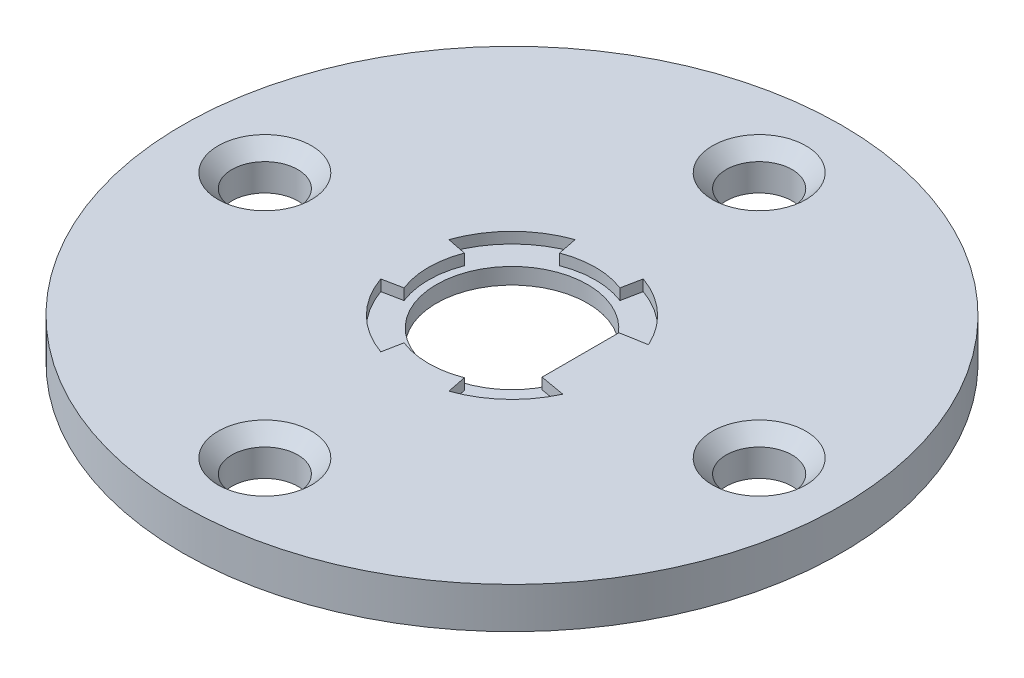
ISO-10303-21;
HEADER;
FILE_DESCRIPTION(('STEP AP214'),'2;1');
FILE_NAME('part.step','',(''),(''),'','','');
FILE_SCHEMA(('AUTOMOTIVE_DESIGN { 1 0 10303 214 1 1 1 1 }'));
ENDSEC;
DATA;
#1=APPLICATION_CONTEXT('core data for automotive mechanical design processes');
#2=APPLICATION_PROTOCOL_DEFINITION('international standard','automotive_design',2000,#1);
#3=PRODUCT_CONTEXT('',#1,'mechanical');
#4=PRODUCT('Part','Part','',(#3));
#5=PRODUCT_RELATED_PRODUCT_CATEGORY('part','',(#4));
#6=PRODUCT_DEFINITION_FORMATION('','',#4);
#7=PRODUCT_DEFINITION_CONTEXT('part definition',#1,'design');
#8=PRODUCT_DEFINITION('design','',#6,#7);
#9=PRODUCT_DEFINITION_SHAPE('','',#8);
#10=(LENGTH_UNIT() NAMED_UNIT(*) SI_UNIT(.MILLI.,.METRE.));
#11=(NAMED_UNIT(*) PLANE_ANGLE_UNIT() SI_UNIT($,.RADIAN.));
#12=(NAMED_UNIT(*) SI_UNIT($,.STERADIAN.) SOLID_ANGLE_UNIT());
#13=UNCERTAINTY_MEASURE_WITH_UNIT(LENGTH_MEASURE(1.E-05),#10,'distance_accuracy_value','');
#14=(GEOMETRIC_REPRESENTATION_CONTEXT(3) GLOBAL_UNCERTAINTY_ASSIGNED_CONTEXT((#13)) GLOBAL_UNIT_ASSIGNED_CONTEXT((#10,
#11,#12)) REPRESENTATION_CONTEXT('',''));
#15=CARTESIAN_POINT('',(0.,0.,0.));
#16=DIRECTION('',(0.,0.,1.));
#17=DIRECTION('',(1.,0.,0.));
#18=AXIS2_PLACEMENT_3D('',#15,#16,#17);
#19=CARTESIAN_POINT('',(0.,0.,0.));
#20=DIRECTION('',(0.,1.,0.));
#21=DIRECTION('',(0.,0.,1.));
#22=AXIS2_PLACEMENT_3D('',#19,#20,#21);
#23=CYLINDRICAL_SURFACE('',#22,5.5);
#24=CARTESIAN_POINT('',(0.,2.18,0.));
#25=DIRECTION('',(0.,1.,0.));
#26=DIRECTION('',(0.,0.,1.));
#27=AXIS2_PLACEMENT_3D('',#24,#25,#26);
#28=CIRCLE('',#27,5.5);
#29=CARTESIAN_POINT('',(4.989999,2.18,2.31298724164207));
#30=VERTEX_POINT('',#29);
#31=CARTESIAN_POINT('',(4.989999,2.18,-2.31298724164207));
#32=VERTEX_POINT('',#31);
#33=EDGE_CURVE('E55',#30,#32,#28,.T.);
#34=ORIENTED_EDGE('',*,*,#33,.T.);
#35=EDGE_CURVE('E158',#32,#30,#28,.T.);
#36=ORIENTED_EDGE('',*,*,#35,.T.);
#37=EDGE_LOOP('',(#34,#36));
#38=FACE_BOUND('',#37,.T.);
#39=CARTESIAN_POINT('',(0.,1.,0.));
#40=DIRECTION('',(0.,-1.,0.));
#41=DIRECTION('',(0.,0.,-1.));
#42=AXIS2_PLACEMENT_3D('',#39,#40,#41);
#43=CIRCLE('',#42,5.5);
#44=CARTESIAN_POINT('',(0.,1.,-5.5));
#45=VERTEX_POINT('',#44);
#46=EDGE_CURVE('E44',#45,#45,#43,.F.);
#47=ORIENTED_EDGE('',*,*,#46,.F.);
#48=EDGE_LOOP('',(#47));
#49=FACE_BOUND('',#48,.T.);
#50=ADVANCED_FACE('F39',(#38,#49),#23,.F.);
#51=CARTESIAN_POINT('',(0.,70.8622509939086,18.));
#52=DIRECTION('',(0.,-1.,0.));
#53=DIRECTION('',(0.,0.,-1.));
#54=AXIS2_PLACEMENT_3D('',#51,#52,#53);
#55=CYLINDRICAL_SURFACE('',#54,2.4);
#56=CARTESIAN_POINT('',(0.,1.98000000000001,18.));
#57=DIRECTION('',(0.,1.,0.));
#58=DIRECTION('',(0.,0.,1.));
#59=AXIS2_PLACEMENT_3D('',#56,#57,#58);
#60=CIRCLE('',#59,2.4);
#61=CARTESIAN_POINT('',(0.,1.98000000000001,20.4));
#62=VERTEX_POINT('',#61);
#63=EDGE_CURVE('E361',#62,#62,#60,.T.);
#64=ORIENTED_EDGE('',*,*,#63,.T.);
#65=EDGE_LOOP('',(#64));
#66=FACE_BOUND('',#65,.T.);
#67=CARTESIAN_POINT('',(0.,0.,18.));
#68=DIRECTION('',(0.,1.,0.));
#69=DIRECTION('',(0.,0.,1.));
#70=AXIS2_PLACEMENT_3D('',#67,#68,#69);
#71=CIRCLE('',#70,2.4);
#72=CARTESIAN_POINT('',(0.,0.,20.4));
#73=VERTEX_POINT('',#72);
#74=EDGE_CURVE('E374',#73,#73,#71,.T.);
#75=ORIENTED_EDGE('',*,*,#74,.F.);
#76=EDGE_LOOP('',(#75));
#77=FACE_BOUND('',#76,.T.);
#78=ADVANCED_FACE('F220',(#66,#77),#55,.F.);
#79=CARTESIAN_POINT('',(-18.,70.8622509939086,0.));
#80=DIRECTION('',(0.,-1.,0.));
#81=DIRECTION('',(0.,0.,-1.));
#82=AXIS2_PLACEMENT_3D('',#79,#80,#81);
#83=CYLINDRICAL_SURFACE('',#82,2.4);
#84=CARTESIAN_POINT('',(-18.,1.98000000000001,0.));
#85=DIRECTION('',(0.,1.,0.));
#86=DIRECTION('',(0.,0.,1.));
#87=AXIS2_PLACEMENT_3D('',#84,#85,#86);
#88=CIRCLE('',#87,2.4);
#89=CARTESIAN_POINT('',(-18.,1.98000000000001,2.40000000000001));
#90=VERTEX_POINT('',#89);
#91=EDGE_CURVE('E11',#90,#90,#88,.T.);
#92=ORIENTED_EDGE('',*,*,#91,.T.);
#93=EDGE_LOOP('',(#92));
#94=FACE_BOUND('',#93,.T.);
#95=CARTESIAN_POINT('',(-18.,0.,0.));
#96=DIRECTION('',(0.,1.,0.));
#97=DIRECTION('',(0.,0.,1.));
#98=AXIS2_PLACEMENT_3D('',#95,#96,#97);
#99=CIRCLE('',#98,2.4);
#100=CARTESIAN_POINT('',(-18.,0.,2.40000000000001));
#101=VERTEX_POINT('',#100);
#102=EDGE_CURVE('E371',#101,#101,#99,.T.);
#103=ORIENTED_EDGE('',*,*,#102,.F.);
#104=EDGE_LOOP('',(#103));
#105=FACE_BOUND('',#104,.T.);
#106=ADVANCED_FACE('F225',(#94,#105),#83,.F.);
#107=CARTESIAN_POINT('',(0.,70.8622509939086,-18.));
#108=DIRECTION('',(0.,-1.,0.));
#109=DIRECTION('',(0.,0.,-1.));
#110=AXIS2_PLACEMENT_3D('',#107,#108,#109);
#111=CYLINDRICAL_SURFACE('',#110,2.4);
#112=CARTESIAN_POINT('',(0.,1.98000000000001,-18.));
#113=DIRECTION('',(0.,1.,0.));
#114=DIRECTION('',(0.,0.,1.));
#115=AXIS2_PLACEMENT_3D('',#112,#113,#114);
#116=CIRCLE('',#115,2.4);
#117=CARTESIAN_POINT('',(0.,1.98000000000001,-15.6));
#118=VERTEX_POINT('',#117);
#119=EDGE_CURVE('E49',#118,#118,#116,.T.);
#120=ORIENTED_EDGE('',*,*,#119,.T.);
#121=EDGE_LOOP('',(#120));
#122=FACE_BOUND('',#121,.T.);
#123=CARTESIAN_POINT('',(0.,0.,-18.));
#124=DIRECTION('',(0.,1.,0.));
#125=DIRECTION('',(0.,0.,1.));
#126=AXIS2_PLACEMENT_3D('',#123,#124,#125);
#127=CIRCLE('',#126,2.4);
#128=CARTESIAN_POINT('',(0.,0.,-15.6));
#129=VERTEX_POINT('',#128);
#130=EDGE_CURVE('E368',#129,#129,#127,.T.);
#131=ORIENTED_EDGE('',*,*,#130,.F.);
#132=EDGE_LOOP('',(#131));
#133=FACE_BOUND('',#132,.T.);
#134=ADVANCED_FACE('F305',(#122,#133),#111,.F.);
#135=CARTESIAN_POINT('',(0.,70.8622509939086,0.));
#136=DIRECTION('',(0.,-1.,0.));
#137=DIRECTION('',(0.,0.,-1.));
#138=AXIS2_PLACEMENT_3D('',#135,#136,#137);
#139=CYLINDRICAL_SURFACE('',#138,24.);
#140=CARTESIAN_POINT('',(0.,0.,0.));
#141=DIRECTION('',(0.,1.,0.));
#142=DIRECTION('',(0.,0.,1.));
#143=AXIS2_PLACEMENT_3D('',#140,#141,#142);
#144=CIRCLE('',#143,24.);
#145=CARTESIAN_POINT('',(0.,0.,24.));
#146=VERTEX_POINT('',#145);
#147=EDGE_CURVE('E365',#146,#146,#144,.T.);
#148=ORIENTED_EDGE('',*,*,#147,.T.);
#149=EDGE_LOOP('',(#148));
#150=FACE_BOUND('',#149,.T.);
#151=CARTESIAN_POINT('',(0.,2.98000000000001,0.));
#152=DIRECTION('',(0.,1.,0.));
#153=DIRECTION('',(0.,0.,1.));
#154=AXIS2_PLACEMENT_3D('',#151,#152,#153);
#155=CIRCLE('',#154,24.);
#156=CARTESIAN_POINT('',(0.,2.98000000000001,24.));
#157=VERTEX_POINT('',#156);
#158=EDGE_CURVE('E364',#157,#157,#155,.T.);
#159=ORIENTED_EDGE('',*,*,#158,.F.);
#160=EDGE_LOOP('',(#159));
#161=FACE_BOUND('',#160,.T.);
#162=ADVANCED_FACE('F309',(#150,#161),#139,.T.);
#163=CARTESIAN_POINT('',(0.,0.,0.));
#164=DIRECTION('',(0.,1.,0.));
#165=DIRECTION('',(0.,0.,1.));
#166=AXIS2_PLACEMENT_3D('',#163,#164,#165);
#167=PLANE('',#166);
#168=CARTESIAN_POINT('',(0.,0.,0.));
#169=DIRECTION('',(0.,-1.,0.));
#170=DIRECTION('',(0.,0.,-1.));
#171=AXIS2_PLACEMENT_3D('',#168,#169,#170);
#172=CIRCLE('',#171,12.);
#173=CARTESIAN_POINT('',(0.,0.,-12.));
#174=VERTEX_POINT('',#173);
#175=EDGE_CURVE('E208',#174,#174,#172,.T.);
#176=ORIENTED_EDGE('',*,*,#175,.F.);
#177=EDGE_LOOP('',(#176));
#178=FACE_BOUND('',#177,.T.);
#179=ORIENTED_EDGE('',*,*,#147,.F.);
#180=EDGE_LOOP('',(#179));
#181=FACE_BOUND('',#180,.T.);
#182=ORIENTED_EDGE('',*,*,#130,.T.);
#183=EDGE_LOOP('',(#182));
#184=FACE_BOUND('',#183,.T.);
#185=ORIENTED_EDGE('',*,*,#102,.T.);
#186=EDGE_LOOP('',(#185));
#187=FACE_BOUND('',#186,.T.);
#188=ORIENTED_EDGE('',*,*,#74,.T.);
#189=EDGE_LOOP('',(#188));
#190=FACE_BOUND('',#189,.T.);
#191=CARTESIAN_POINT('',(18.,0.,0.));
#192=DIRECTION('',(0.,1.,0.));
#193=DIRECTION('',(0.,0.,1.));
#194=AXIS2_PLACEMENT_3D('',#191,#192,#193);
#195=CIRCLE('',#194,2.4);
#196=CARTESIAN_POINT('',(18.,0.,2.4));
#197=VERTEX_POINT('',#196);
#198=EDGE_CURVE('E377',#197,#197,#195,.T.);
#199=ORIENTED_EDGE('',*,*,#198,.T.);
#200=EDGE_LOOP('',(#199));
#201=FACE_BOUND('',#200,.T.);
#202=ADVANCED_FACE('F300',(#178,#181,#184,#187,#190,#201),#167,.F.);
#203=CARTESIAN_POINT('',(18.,70.8622509939086,0.));
#204=DIRECTION('',(0.,-1.,0.));
#205=DIRECTION('',(0.,0.,-1.));
#206=AXIS2_PLACEMENT_3D('',#203,#204,#205);
#207=CYLINDRICAL_SURFACE('',#206,2.4);
#208=CARTESIAN_POINT('',(18.,1.98000000000001,0.));
#209=DIRECTION('',(0.,1.,0.));
#210=DIRECTION('',(0.,0.,1.));
#211=AXIS2_PLACEMENT_3D('',#208,#209,#210);
#212=CIRCLE('',#211,2.4);
#213=CARTESIAN_POINT('',(18.,1.98000000000001,2.4));
#214=VERTEX_POINT('',#213);
#215=EDGE_CURVE('E346',#214,#214,#212,.T.);
#216=ORIENTED_EDGE('',*,*,#215,.T.);
#217=EDGE_LOOP('',(#216));
#218=FACE_BOUND('',#217,.T.);
#219=ORIENTED_EDGE('',*,*,#198,.F.);
#220=EDGE_LOOP('',(#219));
#221=FACE_BOUND('',#220,.T.);
#222=ADVANCED_FACE('F297',(#218,#221),#207,.F.);
#223=CARTESIAN_POINT('',(-0.199538786409,2.98,0.));
#224=DIRECTION('',(0.,1.,0.));
#225=DIRECTION('',(-1.,0.,0.));
#226=AXIS2_PLACEMENT_3D('',#223,#224,#225);
#227=PLANE('',#226);
#228=CARTESIAN_POINT('',(0.,2.98,18.));
#229=DIRECTION('',(0.,1.,0.));
#230=DIRECTION('',(0.,0.,1.));
#231=AXIS2_PLACEMENT_3D('',#228,#229,#230);
#232=CIRCLE('',#231,3.4);
#233=CARTESIAN_POINT('',(0.,2.98,21.4));
#234=VERTEX_POINT('',#233);
#235=EDGE_CURVE('E349',#234,#234,#232,.F.);
#236=ORIENTED_EDGE('',*,*,#235,.T.);
#237=EDGE_LOOP('',(#236));
#238=FACE_BOUND('',#237,.T.);
#239=CARTESIAN_POINT('',(18.,2.98,0.));
#240=DIRECTION('',(0.,1.,0.));
#241=DIRECTION('',(0.,0.,1.));
#242=AXIS2_PLACEMENT_3D('',#239,#240,#241);
#243=CIRCLE('',#242,3.39999999999999);
#244=CARTESIAN_POINT('',(18.,2.98,3.39999999999999));
#245=VERTEX_POINT('',#244);
#246=EDGE_CURVE('E354',#245,#245,#243,.F.);
#247=ORIENTED_EDGE('',*,*,#246,.T.);
#248=EDGE_LOOP('',(#247));
#249=FACE_BOUND('',#248,.T.);
#250=CARTESIAN_POINT('',(0.,2.98,-18.));
#251=DIRECTION('',(0.,1.,0.));
#252=DIRECTION('',(0.,0.,1.));
#253=AXIS2_PLACEMENT_3D('',#250,#251,#252);
#254=CIRCLE('',#253,3.4);
#255=CARTESIAN_POINT('',(0.,2.98,-14.6));
#256=VERTEX_POINT('',#255);
#257=EDGE_CURVE('E343',#256,#256,#254,.F.);
#258=ORIENTED_EDGE('',*,*,#257,.T.);
#259=EDGE_LOOP('',(#258));
#260=FACE_BOUND('',#259,.T.);
#261=CARTESIAN_POINT('',(-18.,2.98,0.));
#262=DIRECTION('',(0.,1.,0.));
#263=DIRECTION('',(0.,0.,1.));
#264=AXIS2_PLACEMENT_3D('',#261,#262,#263);
#265=CIRCLE('',#264,3.4);
#266=CARTESIAN_POINT('',(-18.,2.98,3.4));
#267=VERTEX_POINT('',#266);
#268=EDGE_CURVE('E358',#267,#267,#265,.F.);
#269=ORIENTED_EDGE('',*,*,#268,.T.);
#270=EDGE_LOOP('',(#269));
#271=FACE_BOUND('',#270,.T.);
#272=CARTESIAN_POINT('',(0.,2.98,0.));
#273=DIRECTION('',(0.,1.,0.));
#274=DIRECTION('',(0.,0.,1.));
#275=AXIS2_PLACEMENT_3D('',#272,#273,#274);
#276=CIRCLE('',#275,6.075);
#277=CARTESIAN_POINT('',(-5.66325916882442,2.98,-2.19843594101037));
#278=VERTEX_POINT('',#277);
#279=CARTESIAN_POINT('',(-5.66325916882442,2.98,2.19843594101037));
#280=VERTEX_POINT('',#279);
#281=EDGE_CURVE('E63',#278,#280,#276,.T.);
#282=ORIENTED_EDGE('',*,*,#281,.F.);
#283=DIRECTION('',(0.980901387925874,0.,0.194505699569688));
#284=VECTOR('',#283,1.);
#285=CARTESIAN_POINT('',(-5.66325916882442,2.98,-2.19843594101037));
#286=LINE('',#285,#284);
#287=CARTESIAN_POINT('',(-7.07843787628137,2.98,-2.47905571369933));
#288=VERTEX_POINT('',#287);
#289=EDGE_CURVE('E206',#288,#278,#286,.T.);
#290=ORIENTED_EDGE('',*,*,#289,.F.);
#291=CARTESIAN_POINT('',(0.,2.98,0.));
#292=DIRECTION('',(0.,1.,0.));
#293=DIRECTION('',(0.,0.,1.));
#294=AXIS2_PLACEMENT_3D('',#291,#292,#293);
#295=CIRCLE('',#294,7.50000000000005);
#296=CARTESIAN_POINT('',(-2.47905571369925,2.98,-7.0784378762814));
#297=VERTEX_POINT('',#296);
#298=EDGE_CURVE('E417',#297,#288,#295,.T.);
#299=ORIENTED_EDGE('',*,*,#298,.F.);
#300=DIRECTION('',(-0.194505699569675,0.,-0.980901387925877));
#301=VECTOR('',#300,1.);
#302=CARTESIAN_POINT('',(-2.19843594101032,2.98,-5.66325916882444));
#303=LINE('',#302,#301);
#304=CARTESIAN_POINT('',(-2.19843594101032,2.98,-5.66325916882444));
#305=VERTEX_POINT('',#304);
#306=EDGE_CURVE('E420',#305,#297,#303,.T.);
#307=ORIENTED_EDGE('',*,*,#306,.F.);
#308=CARTESIAN_POINT('',(0.,2.98,0.));
#309=DIRECTION('',(0.,1.,0.));
#310=DIRECTION('',(0.,0.,-1.));
#311=AXIS2_PLACEMENT_3D('',#308,#309,#310);
#312=CIRCLE('',#311,6.07500000000001);
#313=CARTESIAN_POINT('',(2.19843594101031,2.98,-5.66325916882444));
#314=VERTEX_POINT('',#313);
#315=EDGE_CURVE('E423',#314,#305,#312,.T.);
#316=ORIENTED_EDGE('',*,*,#315,.F.);
#317=DIRECTION('',(-0.194505699569675,0.,0.980901387925877));
#318=VECTOR('',#317,1.);
#319=CARTESIAN_POINT('',(2.19843594101031,2.98,-5.66325916882444));
#320=LINE('',#319,#318);
#321=CARTESIAN_POINT('',(2.47905571369925,2.98,-7.0784378762814));
#322=VERTEX_POINT('',#321);
#323=EDGE_CURVE('E426',#322,#314,#320,.T.);
#324=ORIENTED_EDGE('',*,*,#323,.F.);
#325=CARTESIAN_POINT('',(0.,2.98,0.));
#326=DIRECTION('',(0.,1.,0.));
#327=DIRECTION('',(0.,0.,-1.));
#328=AXIS2_PLACEMENT_3D('',#325,#326,#327);
#329=CIRCLE('',#328,7.5);
#330=CARTESIAN_POINT('',(6.81974251928881,2.98,-3.12107545096307));
#331=VERTEX_POINT('',#330);
#332=EDGE_CURVE('E429',#331,#322,#329,.T.);
#333=ORIENTED_EDGE('',*,*,#332,.F.);
#334=DIRECTION('',(0.984807753012207,0.,-0.173648177666934));
#335=VECTOR('',#334,1.);
#336=CARTESIAN_POINT('',(4.989999,2.98,-2.79844230073598));
#337=LINE('',#336,#335);
#338=CARTESIAN_POINT('',(4.989999,2.98,-2.79844230073598));
#339=VERTEX_POINT('',#338);
#340=EDGE_CURVE('E432',#339,#331,#337,.T.);
#341=ORIENTED_EDGE('',*,*,#340,.F.);
#342=DIRECTION('',(0.,0.,-1.));
#343=VECTOR('',#342,1.);
#344=CARTESIAN_POINT('',(4.989999,2.98,-2.79844230073598));
#345=LINE('',#344,#343);
#346=CARTESIAN_POINT('',(4.989999,2.98,2.79844230073598));
#347=VERTEX_POINT('',#346);
#348=EDGE_CURVE('E435',#347,#339,#345,.T.);
#349=ORIENTED_EDGE('',*,*,#348,.F.);
#350=DIRECTION('',(-0.984807753012207,0.,-0.173648177666934));
#351=VECTOR('',#350,1.);
#352=CARTESIAN_POINT('',(4.989999,2.98,2.79844230073598));
#353=LINE('',#352,#351);
#354=CARTESIAN_POINT('',(6.81974251928881,2.98,3.12107545096307));
#355=VERTEX_POINT('',#354);
#356=EDGE_CURVE('E437',#355,#347,#353,.T.);
#357=ORIENTED_EDGE('',*,*,#356,.F.);
#358=CARTESIAN_POINT('',(0.,2.98,0.));
#359=DIRECTION('',(0.,1.,0.));
#360=DIRECTION('',(0.,0.,1.));
#361=AXIS2_PLACEMENT_3D('',#358,#359,#360);
#362=CIRCLE('',#361,7.5);
#363=CARTESIAN_POINT('',(2.47905571369925,2.98,7.0784378762814));
#364=VERTEX_POINT('',#363);
#365=EDGE_CURVE('E440',#364,#355,#362,.T.);
#366=ORIENTED_EDGE('',*,*,#365,.F.);
#367=DIRECTION('',(0.194505699569675,0.,0.980901387925877));
#368=VECTOR('',#367,1.);
#369=CARTESIAN_POINT('',(2.19843594101031,2.98,5.66325916882444));
#370=LINE('',#369,#368);
#371=CARTESIAN_POINT('',(2.19843594101031,2.98,5.66325916882444));
#372=VERTEX_POINT('',#371);
#373=EDGE_CURVE('E443',#372,#364,#370,.T.);
#374=ORIENTED_EDGE('',*,*,#373,.F.);
#375=CARTESIAN_POINT('',(0.,2.98,0.));
#376=DIRECTION('',(0.,1.,0.));
#377=DIRECTION('',(0.,0.,1.));
#378=AXIS2_PLACEMENT_3D('',#375,#376,#377);
#379=CIRCLE('',#378,6.07499999999999);
#380=CARTESIAN_POINT('',(-2.19843594101032,2.98,5.66325916882444));
#381=VERTEX_POINT('',#380);
#382=EDGE_CURVE('E446',#381,#372,#379,.T.);
#383=ORIENTED_EDGE('',*,*,#382,.F.);
#384=DIRECTION('',(0.194505699569675,0.,-0.980901387925877));
#385=VECTOR('',#384,1.);
#386=CARTESIAN_POINT('',(-2.19843594101032,2.98,5.66325916882444));
#387=LINE('',#386,#385);
#388=CARTESIAN_POINT('',(-2.47905571369926,2.98,7.0784378762814));
#389=VERTEX_POINT('',#388);
#390=EDGE_CURVE('E449',#389,#381,#387,.T.);
#391=ORIENTED_EDGE('',*,*,#390,.F.);
#392=CARTESIAN_POINT('',(0.,2.98,0.));
#393=DIRECTION('',(0.,1.,0.));
#394=DIRECTION('',(0.,0.,-1.));
#395=AXIS2_PLACEMENT_3D('',#392,#393,#394);
#396=CIRCLE('',#395,7.5);
#397=CARTESIAN_POINT('',(-7.07843787628135,2.98,2.47905571369932));
#398=VERTEX_POINT('',#397);
#399=EDGE_CURVE('E452',#398,#389,#396,.T.);
#400=ORIENTED_EDGE('',*,*,#399,.F.);
#401=DIRECTION('',(-0.980901387925874,0.,0.194505699569688));
#402=VECTOR('',#401,1.);
#403=CARTESIAN_POINT('',(-5.66325916882442,2.98,2.19843594101037));
#404=LINE('',#403,#402);
#405=EDGE_CURVE('E455',#280,#398,#404,.T.);
#406=ORIENTED_EDGE('',*,*,#405,.F.);
#407=EDGE_LOOP('',(#282,#290,#299,#307,#316,#324,#333,#341,#349,#357,#366,#374,#383,#391,#400,#406));
#408=FACE_BOUND('',#407,.T.);
#409=ORIENTED_EDGE('',*,*,#158,.T.);
#410=EDGE_LOOP('',(#409));
#411=FACE_BOUND('',#410,.T.);
#412=ADVANCED_FACE('F294',(#238,#249,#260,#271,#408,#411),#227,.T.);
#413=CARTESIAN_POINT('',(0.,2.18,0.));
#414=DIRECTION('',(0.,1.,0.));
#415=DIRECTION('',(0.,0.,1.));
#416=AXIS2_PLACEMENT_3D('',#413,#414,#415);
#417=CYLINDRICAL_SURFACE('',#416,6.075);
#418=ORIENTED_EDGE('',*,*,#281,.T.);
#419=DIRECTION('',(0.,1.,0.));
#420=VECTOR('',#419,1.);
#421=CARTESIAN_POINT('',(-5.66325916882442,2.18,2.19843594101037));
#422=LINE('',#421,#420);
#423=CARTESIAN_POINT('',(-5.66325916882442,2.18,2.19843594101037));
#424=VERTEX_POINT('',#423);
#425=EDGE_CURVE('E383',#424,#280,#422,.T.);
#426=ORIENTED_EDGE('',*,*,#425,.F.);
#427=CARTESIAN_POINT('',(0.,2.18,0.));
#428=DIRECTION('',(0.,1.,0.));
#429=DIRECTION('',(0.,0.,1.));
#430=AXIS2_PLACEMENT_3D('',#427,#428,#429);
#431=CIRCLE('',#430,6.075);
#432=CARTESIAN_POINT('',(-5.66325916882442,2.18,-2.19843594101037));
#433=VERTEX_POINT('',#432);
#434=EDGE_CURVE('E204',#433,#424,#431,.T.);
#435=ORIENTED_EDGE('',*,*,#434,.F.);
#436=DIRECTION('',(0.,1.,0.));
#437=VECTOR('',#436,1.);
#438=CARTESIAN_POINT('',(-5.66325916882442,2.18,-2.19843594101037));
#439=LINE('',#438,#437);
#440=EDGE_CURVE('E380',#433,#278,#439,.T.);
#441=ORIENTED_EDGE('',*,*,#440,.T.);
#442=EDGE_LOOP('',(#418,#426,#435,#441));
#443=FACE_BOUND('',#442,.T.);
#444=ADVANCED_FACE('F238',(#443),#417,.F.);
#445=CARTESIAN_POINT('',(-5.66325916882442,2.18,-2.19843594101037));
#446=DIRECTION('',(-0.194505699569688,0.,0.980901387925874));
#447=DIRECTION('',(0.980901387925874,0.,0.194505699569688));
#448=AXIS2_PLACEMENT_3D('',#445,#446,#447);
#449=PLANE('',#448);
#450=ORIENTED_EDGE('',*,*,#289,.T.);
#451=ORIENTED_EDGE('',*,*,#440,.F.);
#452=DIRECTION('',(0.980901387925874,0.,0.194505699569688));
#453=VECTOR('',#452,1.);
#454=CARTESIAN_POINT('',(-5.66325916882442,2.18,-2.19843594101037));
#455=LINE('',#454,#453);
#456=CARTESIAN_POINT('',(-7.07843787628137,2.18,-2.47905571369933));
#457=VERTEX_POINT('',#456);
#458=EDGE_CURVE('E386',#457,#433,#455,.T.);
#459=ORIENTED_EDGE('',*,*,#458,.F.);
#460=DIRECTION('',(0.,1.,0.));
#461=VECTOR('',#460,1.);
#462=CARTESIAN_POINT('',(-7.07843787628137,2.18,-2.47905571369933));
#463=LINE('',#462,#461);
#464=EDGE_CURVE('E412',#457,#288,#463,.T.);
#465=ORIENTED_EDGE('',*,*,#464,.T.);
#466=EDGE_LOOP('',(#450,#451,#459,#465));
#467=FACE_BOUND('',#466,.T.);
#468=ADVANCED_FACE('F234',(#467),#449,.F.);
#469=CARTESIAN_POINT('',(0.,2.18,0.));
#470=DIRECTION('',(0.,1.,0.));
#471=DIRECTION('',(0.,0.,1.));
#472=AXIS2_PLACEMENT_3D('',#469,#470,#471);
#473=CYLINDRICAL_SURFACE('',#472,7.50000000000005);
#474=ORIENTED_EDGE('',*,*,#298,.T.);
#475=ORIENTED_EDGE('',*,*,#464,.F.);
#476=CARTESIAN_POINT('',(0.,2.18,0.));
#477=DIRECTION('',(0.,1.,0.));
#478=DIRECTION('',(0.,0.,1.));
#479=AXIS2_PLACEMENT_3D('',#476,#477,#478);
#480=CIRCLE('',#479,7.50000000000005);
#481=CARTESIAN_POINT('',(-2.47905571369925,2.18,-7.0784378762814));
#482=VERTEX_POINT('',#481);
#483=EDGE_CURVE('E461',#482,#457,#480,.T.);
#484=ORIENTED_EDGE('',*,*,#483,.F.);
#485=DIRECTION('',(0.,1.,0.));
#486=VECTOR('',#485,1.);
#487=CARTESIAN_POINT('',(-2.47905571369925,2.18,-7.0784378762814));
#488=LINE('',#487,#486);
#489=EDGE_CURVE('E410',#482,#297,#488,.T.);
#490=ORIENTED_EDGE('',*,*,#489,.T.);
#491=EDGE_LOOP('',(#474,#475,#484,#490));
#492=FACE_BOUND('',#491,.T.);
#493=ADVANCED_FACE('F237',(#492),#473,.F.);
#494=CARTESIAN_POINT('',(-2.19843594101032,2.18,-5.66325916882444));
#495=DIRECTION('',(0.980901387925877,0.,-0.194505699569675));
#496=DIRECTION('',(-0.194505699569675,0.,-0.980901387925877));
#497=AXIS2_PLACEMENT_3D('',#494,#495,#496);
#498=PLANE('',#497);
#499=ORIENTED_EDGE('',*,*,#306,.T.);
#500=ORIENTED_EDGE('',*,*,#489,.F.);
#501=DIRECTION('',(-0.194505699569675,0.,-0.980901387925877));
#502=VECTOR('',#501,1.);
#503=CARTESIAN_POINT('',(-2.19843594101032,2.18,-5.66325916882444));
#504=LINE('',#503,#502);
#505=CARTESIAN_POINT('',(-2.19843594101032,2.18,-5.66325916882444));
#506=VERTEX_POINT('',#505);
#507=EDGE_CURVE('E464',#506,#482,#504,.T.);
#508=ORIENTED_EDGE('',*,*,#507,.F.);
#509=DIRECTION('',(0.,1.,0.));
#510=VECTOR('',#509,1.);
#511=CARTESIAN_POINT('',(-2.19843594101032,2.18,-5.66325916882444));
#512=LINE('',#511,#510);
#513=EDGE_CURVE('E408',#506,#305,#512,.T.);
#514=ORIENTED_EDGE('',*,*,#513,.T.);
#515=EDGE_LOOP('',(#499,#500,#508,#514));
#516=FACE_BOUND('',#515,.T.);
#517=ADVANCED_FACE('F242',(#516),#498,.F.);
#518=CARTESIAN_POINT('',(0.,2.18,0.));
#519=DIRECTION('',(0.,1.,0.));
#520=DIRECTION('',(0.,0.,1.));
#521=AXIS2_PLACEMENT_3D('',#518,#519,#520);
#522=CYLINDRICAL_SURFACE('',#521,6.07500000000001);
#523=ORIENTED_EDGE('',*,*,#315,.T.);
#524=ORIENTED_EDGE('',*,*,#513,.F.);
#525=CARTESIAN_POINT('',(0.,2.18,0.));
#526=DIRECTION('',(0.,1.,0.));
#527=DIRECTION('',(0.,0.,-1.));
#528=AXIS2_PLACEMENT_3D('',#525,#526,#527);
#529=CIRCLE('',#528,6.07500000000001);
#530=CARTESIAN_POINT('',(2.19843594101031,2.18,-5.66325916882444));
#531=VERTEX_POINT('',#530);
#532=EDGE_CURVE('E467',#531,#506,#529,.T.);
#533=ORIENTED_EDGE('',*,*,#532,.F.);
#534=DIRECTION('',(0.,1.,0.));
#535=VECTOR('',#534,1.);
#536=CARTESIAN_POINT('',(2.19843594101031,2.18,-5.66325916882444));
#537=LINE('',#536,#535);
#538=EDGE_CURVE('E406',#531,#314,#537,.T.);
#539=ORIENTED_EDGE('',*,*,#538,.T.);
#540=EDGE_LOOP('',(#523,#524,#533,#539));
#541=FACE_BOUND('',#540,.T.);
#542=ADVANCED_FACE('F246',(#541),#522,.F.);
#543=CARTESIAN_POINT('',(2.19843594101031,2.18,-5.66325916882444));
#544=DIRECTION('',(-0.980901387925877,0.,-0.194505699569675));
#545=DIRECTION('',(-0.194505699569675,0.,0.980901387925877));
#546=AXIS2_PLACEMENT_3D('',#543,#544,#545);
#547=PLANE('',#546);
#548=ORIENTED_EDGE('',*,*,#323,.T.);
#549=ORIENTED_EDGE('',*,*,#538,.F.);
#550=DIRECTION('',(-0.194505699569675,0.,0.980901387925877));
#551=VECTOR('',#550,1.);
#552=CARTESIAN_POINT('',(2.19843594101031,2.18,-5.66325916882444));
#553=LINE('',#552,#551);
#554=CARTESIAN_POINT('',(2.47905571369925,2.18,-7.0784378762814));
#555=VERTEX_POINT('',#554);
#556=EDGE_CURVE('E470',#555,#531,#553,.T.);
#557=ORIENTED_EDGE('',*,*,#556,.F.);
#558=DIRECTION('',(0.,1.,0.));
#559=VECTOR('',#558,1.);
#560=CARTESIAN_POINT('',(2.47905571369925,2.18,-7.0784378762814));
#561=LINE('',#560,#559);
#562=EDGE_CURVE('E404',#555,#322,#561,.T.);
#563=ORIENTED_EDGE('',*,*,#562,.T.);
#564=EDGE_LOOP('',(#548,#549,#557,#563));
#565=FACE_BOUND('',#564,.T.);
#566=ADVANCED_FACE('F250',(#565),#547,.F.);
#567=CARTESIAN_POINT('',(0.,2.18,0.));
#568=DIRECTION('',(0.,1.,0.));
#569=DIRECTION('',(0.,0.,1.));
#570=AXIS2_PLACEMENT_3D('',#567,#568,#569);
#571=CYLINDRICAL_SURFACE('',#570,7.5);
#572=ORIENTED_EDGE('',*,*,#332,.T.);
#573=ORIENTED_EDGE('',*,*,#562,.F.);
#574=CARTESIAN_POINT('',(0.,2.18,0.));
#575=DIRECTION('',(0.,1.,0.));
#576=DIRECTION('',(0.,0.,-1.));
#577=AXIS2_PLACEMENT_3D('',#574,#575,#576);
#578=CIRCLE('',#577,7.5);
#579=CARTESIAN_POINT('',(6.81974251928881,2.18,-3.12107545096307));
#580=VERTEX_POINT('',#579);
#581=EDGE_CURVE('E183',#580,#555,#578,.T.);
#582=ORIENTED_EDGE('',*,*,#581,.F.);
#583=DIRECTION('',(0.,1.,0.));
#584=VECTOR('',#583,1.);
#585=CARTESIAN_POINT('',(6.81974251928881,2.18,-3.12107545096307));
#586=LINE('',#585,#584);
#587=EDGE_CURVE('E402',#580,#331,#586,.T.);
#588=ORIENTED_EDGE('',*,*,#587,.T.);
#589=EDGE_LOOP('',(#572,#573,#582,#588));
#590=FACE_BOUND('',#589,.T.);
#591=ADVANCED_FACE('F254',(#590),#571,.F.);
#592=CARTESIAN_POINT('',(4.989999,2.18,-2.79844230073598));
#593=DIRECTION('',(0.173648177666934,0.,0.984807753012207));
#594=DIRECTION('',(0.984807753012207,0.,-0.173648177666934));
#595=AXIS2_PLACEMENT_3D('',#592,#593,#594);
#596=PLANE('',#595);
#597=ORIENTED_EDGE('',*,*,#340,.T.);
#598=ORIENTED_EDGE('',*,*,#587,.F.);
#599=DIRECTION('',(0.984807753012207,0.,-0.173648177666934));
#600=VECTOR('',#599,1.);
#601=CARTESIAN_POINT('',(4.989999,2.18,-2.79844230073598));
#602=LINE('',#601,#600);
#603=CARTESIAN_POINT('',(4.989999,2.18,-2.79844230073598));
#604=VERTEX_POINT('',#603);
#605=EDGE_CURVE('E181',#604,#580,#602,.T.);
#606=ORIENTED_EDGE('',*,*,#605,.F.);
#607=DIRECTION('',(0.,1.,0.));
#608=VECTOR('',#607,1.);
#609=CARTESIAN_POINT('',(4.989999,2.18,-2.79844230073598));
#610=LINE('',#609,#608);
#611=EDGE_CURVE('E400',#604,#339,#610,.T.);
#612=ORIENTED_EDGE('',*,*,#611,.T.);
#613=EDGE_LOOP('',(#597,#598,#606,#612));
#614=FACE_BOUND('',#613,.T.);
#615=ADVANCED_FACE('F258',(#614),#596,.F.);
#616=CARTESIAN_POINT('',(4.989999,2.18,-2.79844230073598));
#617=DIRECTION('',(1.,0.,0.));
#618=DIRECTION('',(0.,0.,-1.));
#619=AXIS2_PLACEMENT_3D('',#616,#617,#618);
#620=PLANE('',#619);
#621=ORIENTED_EDGE('',*,*,#348,.T.);
#622=ORIENTED_EDGE('',*,*,#611,.F.);
#623=DIRECTION('',(0.,0.,-1.));
#624=VECTOR('',#623,1.);
#625=CARTESIAN_POINT('',(4.989999,2.18,-2.79844230073598));
#626=LINE('',#625,#624);
#627=EDGE_CURVE('E175',#32,#604,#626,.T.);
#628=ORIENTED_EDGE('',*,*,#627,.F.);
#629=EDGE_CURVE('E167',#30,#32,#626,.T.);
#630=ORIENTED_EDGE('',*,*,#629,.F.);
#631=CARTESIAN_POINT('',(4.989999,2.18,2.79844230073598));
#632=VERTEX_POINT('',#631);
#633=EDGE_CURVE('E172',#632,#30,#626,.T.);
#634=ORIENTED_EDGE('',*,*,#633,.F.);
#635=DIRECTION('',(0.,1.,0.));
#636=VECTOR('',#635,1.);
#637=CARTESIAN_POINT('',(4.989999,2.18,2.79844230073598));
#638=LINE('',#637,#636);
#639=EDGE_CURVE('E398',#632,#347,#638,.T.);
#640=ORIENTED_EDGE('',*,*,#639,.T.);
#641=EDGE_LOOP('',(#621,#622,#628,#630,#634,#640));
#642=FACE_BOUND('',#641,.T.);
#643=ADVANCED_FACE('F171',(#642),#620,.F.);
#644=CARTESIAN_POINT('',(4.989999,2.18,2.79844230073598));
#645=DIRECTION('',(0.173648177666934,0.,-0.984807753012207));
#646=DIRECTION('',(-0.984807753012207,0.,-0.173648177666934));
#647=AXIS2_PLACEMENT_3D('',#644,#645,#646);
#648=PLANE('',#647);
#649=ORIENTED_EDGE('',*,*,#356,.T.);
#650=ORIENTED_EDGE('',*,*,#639,.F.);
#651=DIRECTION('',(-0.984807753012207,0.,-0.173648177666934));
#652=VECTOR('',#651,1.);
#653=CARTESIAN_POINT('',(4.989999,2.18,2.79844230073598));
#654=LINE('',#653,#652);
#655=CARTESIAN_POINT('',(6.81974251928881,2.18,3.12107545096307));
#656=VERTEX_POINT('',#655);
#657=EDGE_CURVE('E180',#656,#632,#654,.T.);
#658=ORIENTED_EDGE('',*,*,#657,.F.);
#659=DIRECTION('',(0.,1.,0.));
#660=VECTOR('',#659,1.);
#661=CARTESIAN_POINT('',(6.81974251928881,2.18,3.12107545096307));
#662=LINE('',#661,#660);
#663=EDGE_CURVE('E396',#656,#355,#662,.T.);
#664=ORIENTED_EDGE('',*,*,#663,.T.);
#665=EDGE_LOOP('',(#649,#650,#658,#664));
#666=FACE_BOUND('',#665,.T.);
#667=ADVANCED_FACE('F265',(#666),#648,.F.);
#668=CARTESIAN_POINT('',(0.,2.18,0.));
#669=DIRECTION('',(0.,1.,0.));
#670=DIRECTION('',(0.,0.,1.));
#671=AXIS2_PLACEMENT_3D('',#668,#669,#670);
#672=CYLINDRICAL_SURFACE('',#671,7.5);
#673=ORIENTED_EDGE('',*,*,#365,.T.);
#674=ORIENTED_EDGE('',*,*,#663,.F.);
#675=CARTESIAN_POINT('',(0.,2.18,0.));
#676=DIRECTION('',(0.,1.,0.));
#677=DIRECTION('',(0.,0.,1.));
#678=AXIS2_PLACEMENT_3D('',#675,#676,#677);
#679=CIRCLE('',#678,7.5);
#680=CARTESIAN_POINT('',(2.47905571369925,2.18,7.0784378762814));
#681=VERTEX_POINT('',#680);
#682=EDGE_CURVE('E186',#681,#656,#679,.T.);
#683=ORIENTED_EDGE('',*,*,#682,.F.);
#684=DIRECTION('',(0.,1.,0.));
#685=VECTOR('',#684,1.);
#686=CARTESIAN_POINT('',(2.47905571369925,2.18,7.0784378762814));
#687=LINE('',#686,#685);
#688=EDGE_CURVE('E394',#681,#364,#687,.T.);
#689=ORIENTED_EDGE('',*,*,#688,.T.);
#690=EDGE_LOOP('',(#673,#674,#683,#689));
#691=FACE_BOUND('',#690,.T.);
#692=ADVANCED_FACE('F268',(#691),#672,.F.);
#693=CARTESIAN_POINT('',(2.19843594101031,2.18,5.66325916882444));
#694=DIRECTION('',(-0.980901387925877,0.,0.194505699569675));
#695=DIRECTION('',(0.194505699569675,0.,0.980901387925877));
#696=AXIS2_PLACEMENT_3D('',#693,#694,#695);
#697=PLANE('',#696);
#698=ORIENTED_EDGE('',*,*,#373,.T.);
#699=ORIENTED_EDGE('',*,*,#688,.F.);
#700=DIRECTION('',(0.194505699569675,0.,0.980901387925877));
#701=VECTOR('',#700,1.);
#702=CARTESIAN_POINT('',(2.19843594101031,2.18,5.66325916882444));
#703=LINE('',#702,#701);
#704=CARTESIAN_POINT('',(2.19843594101031,2.18,5.66325916882444));
#705=VERTEX_POINT('',#704);
#706=EDGE_CURVE('E187',#705,#681,#703,.T.);
#707=ORIENTED_EDGE('',*,*,#706,.F.);
#708=DIRECTION('',(0.,1.,0.));
#709=VECTOR('',#708,1.);
#710=CARTESIAN_POINT('',(2.19843594101031,2.18,5.66325916882444));
#711=LINE('',#710,#709);
#712=EDGE_CURVE('E392',#705,#372,#711,.T.);
#713=ORIENTED_EDGE('',*,*,#712,.T.);
#714=EDGE_LOOP('',(#698,#699,#707,#713));
#715=FACE_BOUND('',#714,.T.);
#716=ADVANCED_FACE('F272',(#715),#697,.F.);
#717=CARTESIAN_POINT('',(0.,2.18,0.));
#718=DIRECTION('',(0.,1.,0.));
#719=DIRECTION('',(0.,0.,1.));
#720=AXIS2_PLACEMENT_3D('',#717,#718,#719);
#721=CYLINDRICAL_SURFACE('',#720,6.07499999999999);
#722=ORIENTED_EDGE('',*,*,#382,.T.);
#723=ORIENTED_EDGE('',*,*,#712,.F.);
#724=CARTESIAN_POINT('',(0.,2.18,0.));
#725=DIRECTION('',(0.,1.,0.));
#726=DIRECTION('',(0.,0.,1.));
#727=AXIS2_PLACEMENT_3D('',#724,#725,#726);
#728=CIRCLE('',#727,6.07499999999999);
#729=CARTESIAN_POINT('',(-2.19843594101032,2.18,5.66325916882444));
#730=VERTEX_POINT('',#729);
#731=EDGE_CURVE('E192',#730,#705,#728,.T.);
#732=ORIENTED_EDGE('',*,*,#731,.F.);
#733=DIRECTION('',(0.,1.,0.));
#734=VECTOR('',#733,1.);
#735=CARTESIAN_POINT('',(-2.19843594101032,2.18,5.66325916882444));
#736=LINE('',#735,#734);
#737=EDGE_CURVE('E390',#730,#381,#736,.T.);
#738=ORIENTED_EDGE('',*,*,#737,.T.);
#739=EDGE_LOOP('',(#722,#723,#732,#738));
#740=FACE_BOUND('',#739,.T.);
#741=ADVANCED_FACE('F276',(#740),#721,.F.);
#742=CARTESIAN_POINT('',(-2.19843594101032,2.18,5.66325916882444));
#743=DIRECTION('',(0.980901387925877,0.,0.194505699569675));
#744=DIRECTION('',(0.194505699569675,0.,-0.980901387925877));
#745=AXIS2_PLACEMENT_3D('',#742,#743,#744);
#746=PLANE('',#745);
#747=ORIENTED_EDGE('',*,*,#390,.T.);
#748=ORIENTED_EDGE('',*,*,#737,.F.);
#749=DIRECTION('',(0.194505699569675,0.,-0.980901387925877));
#750=VECTOR('',#749,1.);
#751=CARTESIAN_POINT('',(-2.19843594101032,2.18,5.66325916882444));
#752=LINE('',#751,#750);
#753=CARTESIAN_POINT('',(-2.47905571369926,2.18,7.0784378762814));
#754=VERTEX_POINT('',#753);
#755=EDGE_CURVE('E195',#754,#730,#752,.T.);
#756=ORIENTED_EDGE('',*,*,#755,.F.);
#757=DIRECTION('',(0.,1.,0.));
#758=VECTOR('',#757,1.);
#759=CARTESIAN_POINT('',(-2.47905571369926,2.18,7.0784378762814));
#760=LINE('',#759,#758);
#761=EDGE_CURVE('E388',#754,#389,#760,.T.);
#762=ORIENTED_EDGE('',*,*,#761,.T.);
#763=EDGE_LOOP('',(#747,#748,#756,#762));
#764=FACE_BOUND('',#763,.T.);
#765=ADVANCED_FACE('F280',(#764),#746,.F.);
#766=CARTESIAN_POINT('',(0.,2.18,0.));
#767=DIRECTION('',(0.,1.,0.));
#768=DIRECTION('',(0.,0.,1.));
#769=AXIS2_PLACEMENT_3D('',#766,#767,#768);
#770=CYLINDRICAL_SURFACE('',#769,7.5);
#771=ORIENTED_EDGE('',*,*,#399,.T.);
#772=ORIENTED_EDGE('',*,*,#761,.F.);
#773=CARTESIAN_POINT('',(0.,2.18,0.));
#774=DIRECTION('',(0.,1.,0.));
#775=DIRECTION('',(0.,0.,-1.));
#776=AXIS2_PLACEMENT_3D('',#773,#774,#775);
#777=CIRCLE('',#776,7.5);
#778=CARTESIAN_POINT('',(-7.07843787628135,2.18,2.47905571369932));
#779=VERTEX_POINT('',#778);
#780=EDGE_CURVE('E198',#779,#754,#777,.T.);
#781=ORIENTED_EDGE('',*,*,#780,.F.);
#782=DIRECTION('',(0.,1.,0.));
#783=VECTOR('',#782,1.);
#784=CARTESIAN_POINT('',(-7.07843787628135,2.18,2.47905571369932));
#785=LINE('',#784,#783);
#786=EDGE_CURVE('E385',#779,#398,#785,.T.);
#787=ORIENTED_EDGE('',*,*,#786,.T.);
#788=EDGE_LOOP('',(#771,#772,#781,#787));
#789=FACE_BOUND('',#788,.T.);
#790=ADVANCED_FACE('F284',(#789),#770,.F.);
#791=CARTESIAN_POINT('',(-5.66325916882442,2.18,2.19843594101037));
#792=DIRECTION('',(-0.194505699569688,0.,-0.980901387925874));
#793=DIRECTION('',(-0.980901387925874,0.,0.194505699569688));
#794=AXIS2_PLACEMENT_3D('',#791,#792,#793);
#795=PLANE('',#794);
#796=ORIENTED_EDGE('',*,*,#405,.T.);
#797=ORIENTED_EDGE('',*,*,#786,.F.);
#798=DIRECTION('',(-0.980901387925874,0.,0.194505699569688));
#799=VECTOR('',#798,1.);
#800=CARTESIAN_POINT('',(-5.66325916882442,2.18,2.19843594101037));
#801=LINE('',#800,#799);
#802=EDGE_CURVE('E201',#424,#779,#801,.T.);
#803=ORIENTED_EDGE('',*,*,#802,.F.);
#804=ORIENTED_EDGE('',*,*,#425,.T.);
#805=EDGE_LOOP('',(#796,#797,#803,#804));
#806=FACE_BOUND('',#805,.T.);
#807=ADVANCED_FACE('F233',(#806),#795,.F.);
#808=CARTESIAN_POINT('',(0.,2.18,0.));
#809=DIRECTION('',(0.,1.,0.));
#810=DIRECTION('',(0.,0.,1.));
#811=AXIS2_PLACEMENT_3D('',#808,#809,#810);
#812=PLANE('',#811);
#813=ORIENTED_EDGE('',*,*,#35,.F.);
#814=ORIENTED_EDGE('',*,*,#627,.T.);
#815=ORIENTED_EDGE('',*,*,#605,.T.);
#816=ORIENTED_EDGE('',*,*,#581,.T.);
#817=ORIENTED_EDGE('',*,*,#556,.T.);
#818=ORIENTED_EDGE('',*,*,#532,.T.);
#819=ORIENTED_EDGE('',*,*,#507,.T.);
#820=ORIENTED_EDGE('',*,*,#483,.T.);
#821=ORIENTED_EDGE('',*,*,#458,.T.);
#822=ORIENTED_EDGE('',*,*,#434,.T.);
#823=ORIENTED_EDGE('',*,*,#802,.T.);
#824=ORIENTED_EDGE('',*,*,#780,.T.);
#825=ORIENTED_EDGE('',*,*,#755,.T.);
#826=ORIENTED_EDGE('',*,*,#731,.T.);
#827=ORIENTED_EDGE('',*,*,#706,.T.);
#828=ORIENTED_EDGE('',*,*,#682,.T.);
#829=ORIENTED_EDGE('',*,*,#657,.T.);
#830=ORIENTED_EDGE('',*,*,#633,.T.);
#831=EDGE_LOOP('',(#813,#814,#815,#816,#817,#818,#819,#820,#821,#822,#823,#824,#825,#826,#827,
#828,#829,#830));
#832=FACE_BOUND('',#831,.T.);
#833=ADVANCED_FACE('F177',(#832),#812,.T.);
#834=CARTESIAN_POINT('',(0.,2.18,0.));
#835=DIRECTION('',(0.,1.,0.));
#836=DIRECTION('',(0.,0.,1.));
#837=AXIS2_PLACEMENT_3D('',#834,#835,#836);
#838=PLANE('',#837);
#839=ORIENTED_EDGE('',*,*,#629,.T.);
#840=ORIENTED_EDGE('',*,*,#33,.F.);
#841=EDGE_LOOP('',(#839,#840));
#842=FACE_BOUND('',#841,.T.);
#843=ADVANCED_FACE('F166',(#842),#838,.F.);
#844=CARTESIAN_POINT('',(0.,1.98000000000001,18.));
#845=DIRECTION('',(0.,1.,0.));
#846=DIRECTION('',(0.,0.,1.));
#847=AXIS2_PLACEMENT_3D('',#844,#845,#846);
#848=CONICAL_SURFACE('',#847,2.4,0.78539816339745);
#849=ORIENTED_EDGE('',*,*,#235,.F.);
#850=EDGE_LOOP('',(#849));
#851=FACE_BOUND('',#850,.T.);
#852=ORIENTED_EDGE('',*,*,#63,.F.);
#853=EDGE_LOOP('',(#852));
#854=FACE_BOUND('',#853,.T.);
#855=ADVANCED_FACE('F318',(#851,#854),#848,.F.);
#856=CARTESIAN_POINT('',(18.,1.98000000000001,0.));
#857=DIRECTION('',(0.,1.,0.));
#858=DIRECTION('',(0.,0.,1.));
#859=AXIS2_PLACEMENT_3D('',#856,#857,#858);
#860=CONICAL_SURFACE('',#859,2.4,0.785398163397445);
#861=ORIENTED_EDGE('',*,*,#246,.F.);
#862=EDGE_LOOP('',(#861));
#863=FACE_BOUND('',#862,.T.);
#864=ORIENTED_EDGE('',*,*,#215,.F.);
#865=EDGE_LOOP('',(#864));
#866=FACE_BOUND('',#865,.T.);
#867=ADVANCED_FACE('F324',(#863,#866),#860,.F.);
#868=CARTESIAN_POINT('',(0.,1.98000000000001,-18.));
#869=DIRECTION('',(0.,1.,0.));
#870=DIRECTION('',(0.,0.,1.));
#871=AXIS2_PLACEMENT_3D('',#868,#869,#870);
#872=CONICAL_SURFACE('',#871,2.4,0.78539816339745);
#873=ORIENTED_EDGE('',*,*,#257,.F.);
#874=EDGE_LOOP('',(#873));
#875=FACE_BOUND('',#874,.T.);
#876=ORIENTED_EDGE('',*,*,#119,.F.);
#877=EDGE_LOOP('',(#876));
#878=FACE_BOUND('',#877,.T.);
#879=ADVANCED_FACE('F330',(#875,#878),#872,.F.);
#880=CARTESIAN_POINT('',(-18.,1.98000000000001,0.));
#881=DIRECTION('',(0.,1.,0.));
#882=DIRECTION('',(0.,0.,1.));
#883=AXIS2_PLACEMENT_3D('',#880,#881,#882);
#884=CONICAL_SURFACE('',#883,2.4,0.78539816339745);
#885=ORIENTED_EDGE('',*,*,#268,.F.);
#886=EDGE_LOOP('',(#885));
#887=FACE_BOUND('',#886,.T.);
#888=ORIENTED_EDGE('',*,*,#91,.F.);
#889=EDGE_LOOP('',(#888));
#890=FACE_BOUND('',#889,.T.);
#891=ADVANCED_FACE('F42',(#887,#890),#884,.F.);
#892=CARTESIAN_POINT('',(0.,1.,0.));
#893=DIRECTION('',(0.,-1.,0.));
#894=DIRECTION('',(0.,0.,-1.));
#895=AXIS2_PLACEMENT_3D('',#892,#893,#894);
#896=PLANE('',#895);
#897=CARTESIAN_POINT('',(0.,1.,0.));
#898=DIRECTION('',(0.,-1.,0.));
#899=DIRECTION('',(0.,0.,-1.));
#900=AXIS2_PLACEMENT_3D('',#897,#898,#899);
#901=CIRCLE('',#900,12.);
#902=CARTESIAN_POINT('',(0.,1.,-12.));
#903=VERTEX_POINT('',#902);
#904=EDGE_CURVE('E211',#903,#903,#901,.T.);
#905=ORIENTED_EDGE('',*,*,#904,.T.);
#906=EDGE_LOOP('',(#905));
#907=FACE_BOUND('',#906,.T.);
#908=ORIENTED_EDGE('',*,*,#46,.T.);
#909=EDGE_LOOP('',(#908));
#910=FACE_BOUND('',#909,.T.);
#911=ADVANCED_FACE('F218',(#907,#910),#896,.T.);
#912=CARTESIAN_POINT('',(0.,1.,0.));
#913=DIRECTION('',(0.,-1.,0.));
#914=DIRECTION('',(0.,0.,-1.));
#915=AXIS2_PLACEMENT_3D('',#912,#913,#914);
#916=CYLINDRICAL_SURFACE('',#915,12.);
#917=ORIENTED_EDGE('',*,*,#904,.F.);
#918=EDGE_LOOP('',(#917));
#919=FACE_BOUND('',#918,.T.);
#920=ORIENTED_EDGE('',*,*,#175,.T.);
#921=EDGE_LOOP('',(#920));
#922=FACE_BOUND('',#921,.T.);
#923=ADVANCED_FACE('F536',(#919,#922),#916,.F.);
#924=CLOSED_SHELL('',(#50,#78,#106,#134,#162,#202,#222,#412,#444,#468,#493,#517,#542,#566,#591,
#615,#643,#667,#692,#716,#741,#765,#790,#807,#833,#843,#855,#867,#879,#891,#911,#923));
#925=MANIFOLD_SOLID_BREP('B2',#924);
#926=ADVANCED_BREP_SHAPE_REPRESENTATION('',(#18,#925),#14);
#927=SHAPE_DEFINITION_REPRESENTATION(#9,#926);
ENDSEC;
END-ISO-10303-21;
